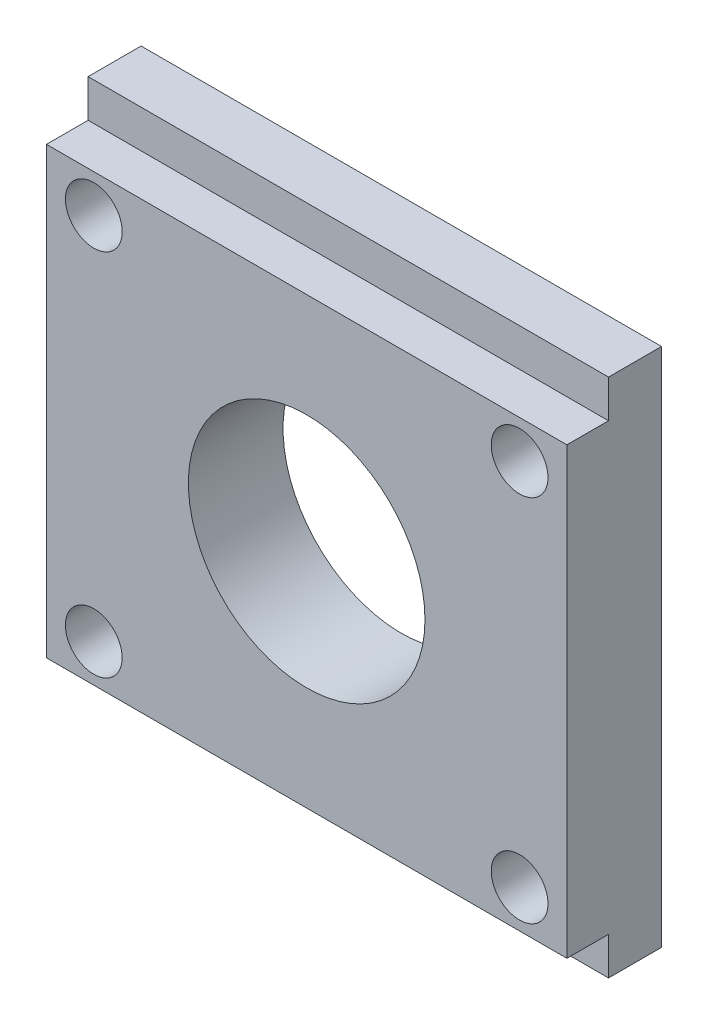
ISO-10303-21;
HEADER;
FILE_DESCRIPTION(('STEP AP214'),'2;1');
FILE_NAME('part.step','',(''),(''),'','','');
FILE_SCHEMA(('AUTOMOTIVE_DESIGN { 1 0 10303 214 1 1 1 1 }'));
ENDSEC;
DATA;
#1=APPLICATION_CONTEXT('core data for automotive mechanical design processes');
#2=APPLICATION_PROTOCOL_DEFINITION('international standard','automotive_design',2000,#1);
#3=PRODUCT_CONTEXT('',#1,'mechanical');
#4=PRODUCT('Part','Part','',(#3));
#5=PRODUCT_RELATED_PRODUCT_CATEGORY('part','',(#4));
#6=PRODUCT_DEFINITION_FORMATION('','',#4);
#7=PRODUCT_DEFINITION_CONTEXT('part definition',#1,'design');
#8=PRODUCT_DEFINITION('design','',#6,#7);
#9=PRODUCT_DEFINITION_SHAPE('','',#8);
#10=(LENGTH_UNIT() NAMED_UNIT(*) SI_UNIT(.MILLI.,.METRE.));
#11=(NAMED_UNIT(*) PLANE_ANGLE_UNIT() SI_UNIT($,.RADIAN.));
#12=(NAMED_UNIT(*) SI_UNIT($,.STERADIAN.) SOLID_ANGLE_UNIT());
#13=UNCERTAINTY_MEASURE_WITH_UNIT(LENGTH_MEASURE(1.E-05),#10,'distance_accuracy_value','');
#14=(GEOMETRIC_REPRESENTATION_CONTEXT(3) GLOBAL_UNCERTAINTY_ASSIGNED_CONTEXT((#13)) GLOBAL_UNIT_ASSIGNED_CONTEXT((#10,
#11,#12)) REPRESENTATION_CONTEXT('',''));
#15=CARTESIAN_POINT('',(0.,0.,0.));
#16=DIRECTION('',(0.,0.,1.));
#17=DIRECTION('',(1.,0.,0.));
#18=AXIS2_PLACEMENT_3D('',#15,#16,#17);
#19=CARTESIAN_POINT('',(0.,32.385,6.35));
#20=DIRECTION('',(0.,-1.,0.));
#21=DIRECTION('',(0.,0.,-1.));
#22=AXIS2_PLACEMENT_3D('',#19,#20,#21);
#23=PLANE('',#22);
#24=DIRECTION('',(0.,0.,1.));
#25=VECTOR('',#24,1.);
#26=CARTESIAN_POINT('',(0.,32.385,0.));
#27=LINE('',#26,#25);
#28=CARTESIAN_POINT('',(0.,32.385,6.35));
#29=VERTEX_POINT('',#28);
#30=CARTESIAN_POINT('',(0.,32.385,3.556));
#31=VERTEX_POINT('',#30);
#32=EDGE_CURVE('E99',#29,#31,#27,.F.);
#33=ORIENTED_EDGE('',*,*,#32,.F.);
#34=DIRECTION('',(1.,0.,0.));
#35=VECTOR('',#34,1.);
#36=CARTESIAN_POINT('',(17.4625,32.385,6.35));
#37=LINE('',#36,#35);
#38=CARTESIAN_POINT('',(34.925,32.385,6.35));
#39=VERTEX_POINT('',#38);
#40=EDGE_CURVE('E98',#39,#29,#37,.F.);
#41=ORIENTED_EDGE('',*,*,#40,.F.);
#42=DIRECTION('',(0.,0.,-1.));
#43=VECTOR('',#42,1.);
#44=CARTESIAN_POINT('',(34.925,32.385,0.));
#45=LINE('',#44,#43);
#46=CARTESIAN_POINT('',(34.925,32.385,3.556));
#47=VERTEX_POINT('',#46);
#48=EDGE_CURVE('E86',#47,#39,#45,.F.);
#49=ORIENTED_EDGE('',*,*,#48,.F.);
#50=DIRECTION('',(1.,0.,0.));
#51=VECTOR('',#50,1.);
#52=CARTESIAN_POINT('',(17.4625,32.385,3.556));
#53=LINE('',#52,#51);
#54=EDGE_CURVE('E80',#31,#47,#53,.T.);
#55=ORIENTED_EDGE('',*,*,#54,.F.);
#56=EDGE_LOOP('',(#33,#41,#49,#55));
#57=FACE_BOUND('',#56,.T.);
#58=ADVANCED_FACE('F17',(#57),#23,.F.);
#59=CARTESIAN_POINT('',(17.4625,33.655,3.556));
#60=DIRECTION('',(0.,0.,1.));
#61=DIRECTION('',(1.,0.,0.));
#62=AXIS2_PLACEMENT_3D('',#59,#60,#61);
#63=PLANE('',#62);
#64=DIRECTION('',(1.,0.,0.));
#65=VECTOR('',#64,1.);
#66=CARTESIAN_POINT('',(0.,34.925,3.556));
#67=LINE('',#66,#65);
#68=CARTESIAN_POINT('',(0.,34.925,3.556));
#69=VERTEX_POINT('',#68);
#70=CARTESIAN_POINT('',(34.925,34.925,3.556));
#71=VERTEX_POINT('',#70);
#72=EDGE_CURVE('E169',#69,#71,#67,.T.);
#73=ORIENTED_EDGE('',*,*,#72,.F.);
#74=DIRECTION('',(0.,1.,0.));
#75=VECTOR('',#74,1.);
#76=CARTESIAN_POINT('',(0.,0.,3.556));
#77=LINE('',#76,#75);
#78=EDGE_CURVE('E164',#31,#69,#77,.T.);
#79=ORIENTED_EDGE('',*,*,#78,.F.);
#80=ORIENTED_EDGE('',*,*,#54,.T.);
#81=DIRECTION('',(0.,1.,0.));
#82=VECTOR('',#81,1.);
#83=CARTESIAN_POINT('',(34.925,34.925,3.556));
#84=LINE('',#83,#82);
#85=EDGE_CURVE('E93',#71,#47,#84,.F.);
#86=ORIENTED_EDGE('',*,*,#85,.F.);
#87=EDGE_LOOP('',(#73,#79,#80,#86));
#88=FACE_BOUND('',#87,.T.);
#89=ADVANCED_FACE('F235',(#88),#63,.T.);
#90=CARTESIAN_POINT('',(34.925,2.54000000000003,6.35));
#91=DIRECTION('',(0.,1.,0.));
#92=DIRECTION('',(0.,0.,1.));
#93=AXIS2_PLACEMENT_3D('',#90,#91,#92);
#94=PLANE('',#93);
#95=DIRECTION('',(0.,0.,-1.));
#96=VECTOR('',#95,1.);
#97=CARTESIAN_POINT('',(34.925,2.54000000000003,0.));
#98=LINE('',#97,#96);
#99=CARTESIAN_POINT('',(34.925,2.54000000000001,6.35));
#100=VERTEX_POINT('',#99);
#101=CARTESIAN_POINT('',(34.925,2.54000000000003,3.556));
#102=VERTEX_POINT('',#101);
#103=EDGE_CURVE('E107',#100,#102,#98,.T.);
#104=ORIENTED_EDGE('',*,*,#103,.F.);
#105=DIRECTION('',(1.,0.,0.));
#106=VECTOR('',#105,1.);
#107=CARTESIAN_POINT('',(17.4625,2.54,6.35));
#108=LINE('',#107,#106);
#109=CARTESIAN_POINT('',(0.,2.54000000000001,6.35));
#110=VERTEX_POINT('',#109);
#111=EDGE_CURVE('E95',#110,#100,#108,.T.);
#112=ORIENTED_EDGE('',*,*,#111,.F.);
#113=DIRECTION('',(0.,0.,1.));
#114=VECTOR('',#113,1.);
#115=CARTESIAN_POINT('',(0.,2.54,0.));
#116=LINE('',#115,#114);
#117=CARTESIAN_POINT('',(0.,2.54000000000002,3.556));
#118=VERTEX_POINT('',#117);
#119=EDGE_CURVE('E157',#118,#110,#116,.T.);
#120=ORIENTED_EDGE('',*,*,#119,.F.);
#121=DIRECTION('',(1.,0.,0.));
#122=VECTOR('',#121,1.);
#123=CARTESIAN_POINT('',(17.4625,2.54000000000003,3.556));
#124=LINE('',#123,#122);
#125=EDGE_CURVE('E103',#102,#118,#124,.F.);
#126=ORIENTED_EDGE('',*,*,#125,.F.);
#127=EDGE_LOOP('',(#104,#112,#120,#126));
#128=FACE_BOUND('',#127,.T.);
#129=ADVANCED_FACE('F237',(#128),#94,.F.);
#130=CARTESIAN_POINT('',(17.4625,1.27,3.556));
#131=DIRECTION('',(0.,0.,1.));
#132=DIRECTION('',(1.,0.,0.));
#133=AXIS2_PLACEMENT_3D('',#130,#131,#132);
#134=PLANE('',#133);
#135=DIRECTION('',(0.,1.,0.));
#136=VECTOR('',#135,1.);
#137=CARTESIAN_POINT('',(0.,0.,3.556));
#138=LINE('',#137,#136);
#139=CARTESIAN_POINT('',(0.,0.,3.556));
#140=VERTEX_POINT('',#139);
#141=EDGE_CURVE('E159',#140,#118,#138,.T.);
#142=ORIENTED_EDGE('',*,*,#141,.F.);
#143=DIRECTION('',(1.,0.,0.));
#144=VECTOR('',#143,1.);
#145=CARTESIAN_POINT('',(34.925,0.,3.556));
#146=LINE('',#145,#144);
#147=CARTESIAN_POINT('',(34.925,0.,3.556));
#148=VERTEX_POINT('',#147);
#149=EDGE_CURVE('E149',#148,#140,#146,.F.);
#150=ORIENTED_EDGE('',*,*,#149,.F.);
#151=DIRECTION('',(0.,1.,0.));
#152=VECTOR('',#151,1.);
#153=CARTESIAN_POINT('',(34.925,34.925,3.556));
#154=LINE('',#153,#152);
#155=EDGE_CURVE('E109',#102,#148,#154,.F.);
#156=ORIENTED_EDGE('',*,*,#155,.F.);
#157=ORIENTED_EDGE('',*,*,#125,.T.);
#158=EDGE_LOOP('',(#142,#150,#156,#157));
#159=FACE_BOUND('',#158,.T.);
#160=ADVANCED_FACE('F176',(#159),#134,.T.);
#161=CARTESIAN_POINT('',(17.4625,17.4625,6.35));
#162=DIRECTION('',(0.,0.,1.));
#163=DIRECTION('',(1.,0.,0.));
#164=AXIS2_PLACEMENT_3D('',#161,#162,#163);
#165=PLANE('',#164);
#166=CARTESIAN_POINT('',(17.4625,17.4625,6.35));
#167=DIRECTION('',(0.,0.,1.));
#168=DIRECTION('',(1.,0.,0.));
#169=AXIS2_PLACEMENT_3D('',#166,#167,#168);
#170=CIRCLE('',#169,7.9375);
#171=CARTESIAN_POINT('',(25.4,17.4625,6.35));
#172=VERTEX_POINT('',#171);
#173=EDGE_CURVE('E20',#172,#172,#170,.F.);
#174=ORIENTED_EDGE('',*,*,#173,.T.);
#175=EDGE_LOOP('',(#174));
#176=FACE_BOUND('',#175,.T.);
#177=CARTESIAN_POINT('',(31.75,5.08,6.35));
#178=DIRECTION('',(0.,0.,1.));
#179=DIRECTION('',(1.,0.,0.));
#180=AXIS2_PLACEMENT_3D('',#177,#178,#179);
#181=CIRCLE('',#180,1.905);
#182=CARTESIAN_POINT('',(33.655,5.08,6.35));
#183=VERTEX_POINT('',#182);
#184=EDGE_CURVE('E137',#183,#183,#181,.F.);
#185=ORIENTED_EDGE('',*,*,#184,.T.);
#186=EDGE_LOOP('',(#185));
#187=FACE_BOUND('',#186,.T.);
#188=CARTESIAN_POINT('',(3.175,5.08,6.35));
#189=DIRECTION('',(0.,0.,1.));
#190=DIRECTION('',(1.,0.,0.));
#191=AXIS2_PLACEMENT_3D('',#188,#189,#190);
#192=CIRCLE('',#191,1.905);
#193=CARTESIAN_POINT('',(5.08,5.08,6.35));
#194=VERTEX_POINT('',#193);
#195=EDGE_CURVE('E135',#194,#194,#192,.F.);
#196=ORIENTED_EDGE('',*,*,#195,.T.);
#197=EDGE_LOOP('',(#196));
#198=FACE_BOUND('',#197,.T.);
#199=CARTESIAN_POINT('',(31.75,29.845,6.35));
#200=DIRECTION('',(0.,0.,1.));
#201=DIRECTION('',(1.,0.,0.));
#202=AXIS2_PLACEMENT_3D('',#199,#200,#201);
#203=CIRCLE('',#202,1.905);
#204=CARTESIAN_POINT('',(33.655,29.845,6.35));
#205=VERTEX_POINT('',#204);
#206=EDGE_CURVE('E132',#205,#205,#203,.F.);
#207=ORIENTED_EDGE('',*,*,#206,.T.);
#208=EDGE_LOOP('',(#207));
#209=FACE_BOUND('',#208,.T.);
#210=CARTESIAN_POINT('',(3.175,29.845,6.35));
#211=DIRECTION('',(0.,0.,1.));
#212=DIRECTION('',(1.,0.,0.));
#213=AXIS2_PLACEMENT_3D('',#210,#211,#212);
#214=CIRCLE('',#213,1.905);
#215=CARTESIAN_POINT('',(5.08,29.845,6.35));
#216=VERTEX_POINT('',#215);
#217=EDGE_CURVE('E128',#216,#216,#214,.F.);
#218=ORIENTED_EDGE('',*,*,#217,.T.);
#219=EDGE_LOOP('',(#218));
#220=FACE_BOUND('',#219,.T.);
#221=ORIENTED_EDGE('',*,*,#111,.T.);
#222=DIRECTION('',(0.,1.,0.));
#223=VECTOR('',#222,1.);
#224=CARTESIAN_POINT('',(34.925,34.925,6.35));
#225=LINE('',#224,#223);
#226=EDGE_CURVE('E91',#39,#100,#225,.F.);
#227=ORIENTED_EDGE('',*,*,#226,.F.);
#228=ORIENTED_EDGE('',*,*,#40,.T.);
#229=DIRECTION('',(0.,1.,0.));
#230=VECTOR('',#229,1.);
#231=CARTESIAN_POINT('',(0.,0.,6.35));
#232=LINE('',#231,#230);
#233=EDGE_CURVE('E155',#110,#29,#232,.T.);
#234=ORIENTED_EDGE('',*,*,#233,.F.);
#235=EDGE_LOOP('',(#221,#227,#228,#234));
#236=FACE_BOUND('',#235,.T.);
#237=ADVANCED_FACE('F105',(#176,#187,#198,#209,#220,#236),#165,.T.);
#238=CARTESIAN_POINT('',(34.925,34.925,0.));
#239=DIRECTION('',(1.,0.,0.));
#240=DIRECTION('',(0.,0.,-1.));
#241=AXIS2_PLACEMENT_3D('',#238,#239,#240);
#242=PLANE('',#241);
#243=DIRECTION('',(0.,0.,1.));
#244=VECTOR('',#243,1.);
#245=CARTESIAN_POINT('',(34.925,34.925,0.));
#246=LINE('',#245,#244);
#247=CARTESIAN_POINT('',(34.925,34.925,0.));
#248=VERTEX_POINT('',#247);
#249=EDGE_CURVE('E167',#71,#248,#246,.F.);
#250=ORIENTED_EDGE('',*,*,#249,.F.);
#251=ORIENTED_EDGE('',*,*,#85,.T.);
#252=ORIENTED_EDGE('',*,*,#48,.T.);
#253=ORIENTED_EDGE('',*,*,#226,.T.);
#254=ORIENTED_EDGE('',*,*,#103,.T.);
#255=ORIENTED_EDGE('',*,*,#155,.T.);
#256=DIRECTION('',(0.,0.,-1.));
#257=VECTOR('',#256,1.);
#258=CARTESIAN_POINT('',(34.925,0.,0.));
#259=LINE('',#258,#257);
#260=CARTESIAN_POINT('',(34.925,0.,0.));
#261=VERTEX_POINT('',#260);
#262=EDGE_CURVE('E142',#261,#148,#259,.F.);
#263=ORIENTED_EDGE('',*,*,#262,.F.);
#264=DIRECTION('',(0.,1.,0.));
#265=VECTOR('',#264,1.);
#266=CARTESIAN_POINT('',(34.925,17.4625,0.));
#267=LINE('',#266,#265);
#268=EDGE_CURVE('E131',#261,#248,#267,.T.);
#269=ORIENTED_EDGE('',*,*,#268,.T.);
#270=EDGE_LOOP('',(#250,#251,#252,#253,#254,#255,#263,#269));
#271=FACE_BOUND('',#270,.T.);
#272=ADVANCED_FACE('F89',(#271),#242,.T.);
#273=CARTESIAN_POINT('',(0.,34.925,0.));
#274=DIRECTION('',(0.,1.,0.));
#275=DIRECTION('',(0.,0.,1.));
#276=AXIS2_PLACEMENT_3D('',#273,#274,#275);
#277=PLANE('',#276);
#278=DIRECTION('',(1.,0.,0.));
#279=VECTOR('',#278,1.);
#280=CARTESIAN_POINT('',(17.4625,34.925,0.));
#281=LINE('',#280,#279);
#282=CARTESIAN_POINT('',(0.,34.925,0.));
#283=VERTEX_POINT('',#282);
#284=EDGE_CURVE('E229',#248,#283,#281,.F.);
#285=ORIENTED_EDGE('',*,*,#284,.T.);
#286=DIRECTION('',(0.,0.,1.));
#287=VECTOR('',#286,1.);
#288=CARTESIAN_POINT('',(0.,34.925,0.));
#289=LINE('',#288,#287);
#290=EDGE_CURVE('E162',#69,#283,#289,.F.);
#291=ORIENTED_EDGE('',*,*,#290,.F.);
#292=ORIENTED_EDGE('',*,*,#72,.T.);
#293=ORIENTED_EDGE('',*,*,#249,.T.);
#294=EDGE_LOOP('',(#285,#291,#292,#293));
#295=FACE_BOUND('',#294,.T.);
#296=ADVANCED_FACE('F190',(#295),#277,.T.);
#297=CARTESIAN_POINT('',(0.,0.,0.));
#298=DIRECTION('',(-1.,0.,0.));
#299=DIRECTION('',(0.,0.,1.));
#300=AXIS2_PLACEMENT_3D('',#297,#298,#299);
#301=PLANE('',#300);
#302=ORIENTED_EDGE('',*,*,#119,.T.);
#303=ORIENTED_EDGE('',*,*,#233,.T.);
#304=ORIENTED_EDGE('',*,*,#32,.T.);
#305=ORIENTED_EDGE('',*,*,#78,.T.);
#306=ORIENTED_EDGE('',*,*,#290,.T.);
#307=DIRECTION('',(0.,1.,0.));
#308=VECTOR('',#307,1.);
#309=CARTESIAN_POINT('',(0.,17.4625,0.));
#310=LINE('',#309,#308);
#311=CARTESIAN_POINT('',(0.,0.,0.));
#312=VERTEX_POINT('',#311);
#313=EDGE_CURVE('E227',#283,#312,#310,.F.);
#314=ORIENTED_EDGE('',*,*,#313,.T.);
#315=DIRECTION('',(0.,0.,-1.));
#316=VECTOR('',#315,1.);
#317=CARTESIAN_POINT('',(0.,0.,0.));
#318=LINE('',#317,#316);
#319=EDGE_CURVE('E35',#140,#312,#318,.T.);
#320=ORIENTED_EDGE('',*,*,#319,.F.);
#321=ORIENTED_EDGE('',*,*,#141,.T.);
#322=EDGE_LOOP('',(#302,#303,#304,#305,#306,#314,#320,#321));
#323=FACE_BOUND('',#322,.T.);
#324=ADVANCED_FACE('F180',(#323),#301,.T.);
#325=CARTESIAN_POINT('',(34.925,0.,0.));
#326=DIRECTION('',(0.,-1.,0.));
#327=DIRECTION('',(0.,0.,-1.));
#328=AXIS2_PLACEMENT_3D('',#325,#326,#327);
#329=PLANE('',#328);
#330=DIRECTION('',(1.,0.,0.));
#331=VECTOR('',#330,1.);
#332=CARTESIAN_POINT('',(17.4625,0.,0.));
#333=LINE('',#332,#331);
#334=EDGE_CURVE('E127',#312,#261,#333,.T.);
#335=ORIENTED_EDGE('',*,*,#334,.T.);
#336=ORIENTED_EDGE('',*,*,#262,.T.);
#337=ORIENTED_EDGE('',*,*,#149,.T.);
#338=ORIENTED_EDGE('',*,*,#319,.T.);
#339=EDGE_LOOP('',(#335,#336,#337,#338));
#340=FACE_BOUND('',#339,.T.);
#341=ADVANCED_FACE('F177',(#340),#329,.T.);
#342=CARTESIAN_POINT('',(17.4625,17.4625,0.));
#343=DIRECTION('',(0.,0.,1.));
#344=DIRECTION('',(1.,0.,0.));
#345=AXIS2_PLACEMENT_3D('',#342,#343,#344);
#346=CYLINDRICAL_SURFACE('',#345,7.9375);
#347=CARTESIAN_POINT('',(17.4625,17.4625,0.));
#348=DIRECTION('',(0.,0.,1.));
#349=DIRECTION('',(1.,0.,0.));
#350=AXIS2_PLACEMENT_3D('',#347,#348,#349);
#351=CIRCLE('',#350,7.9375);
#352=CARTESIAN_POINT('',(25.4,17.4625,0.));
#353=VERTEX_POINT('',#352);
#354=EDGE_CURVE('E124',#353,#353,#351,.F.);
#355=ORIENTED_EDGE('',*,*,#354,.T.);
#356=EDGE_LOOP('',(#355));
#357=FACE_BOUND('',#356,.T.);
#358=ORIENTED_EDGE('',*,*,#173,.F.);
#359=EDGE_LOOP('',(#358));
#360=FACE_BOUND('',#359,.T.);
#361=ADVANCED_FACE('F179',(#357,#360),#346,.F.);
#362=CARTESIAN_POINT('',(31.75,5.08,0.));
#363=DIRECTION('',(0.,0.,1.));
#364=DIRECTION('',(1.,0.,0.));
#365=AXIS2_PLACEMENT_3D('',#362,#363,#364);
#366=CYLINDRICAL_SURFACE('',#365,1.905);
#367=CARTESIAN_POINT('',(31.75,5.08,0.));
#368=DIRECTION('',(0.,0.,1.));
#369=DIRECTION('',(1.,0.,0.));
#370=AXIS2_PLACEMENT_3D('',#367,#368,#369);
#371=CIRCLE('',#370,1.905);
#372=CARTESIAN_POINT('',(33.655,5.08,0.));
#373=VERTEX_POINT('',#372);
#374=EDGE_CURVE('E121',#373,#373,#371,.F.);
#375=ORIENTED_EDGE('',*,*,#374,.T.);
#376=EDGE_LOOP('',(#375));
#377=FACE_BOUND('',#376,.T.);
#378=ORIENTED_EDGE('',*,*,#184,.F.);
#379=EDGE_LOOP('',(#378));
#380=FACE_BOUND('',#379,.T.);
#381=ADVANCED_FACE('F187',(#377,#380),#366,.F.);
#382=CARTESIAN_POINT('',(3.175,5.08,0.));
#383=DIRECTION('',(0.,0.,1.));
#384=DIRECTION('',(1.,0.,0.));
#385=AXIS2_PLACEMENT_3D('',#382,#383,#384);
#386=CYLINDRICAL_SURFACE('',#385,1.905);
#387=CARTESIAN_POINT('',(3.175,5.08,0.));
#388=DIRECTION('',(0.,0.,1.));
#389=DIRECTION('',(1.,0.,0.));
#390=AXIS2_PLACEMENT_3D('',#387,#388,#389);
#391=CIRCLE('',#390,1.905);
#392=CARTESIAN_POINT('',(5.08,5.08,0.));
#393=VERTEX_POINT('',#392);
#394=EDGE_CURVE('E118',#393,#393,#391,.F.);
#395=ORIENTED_EDGE('',*,*,#394,.T.);
#396=EDGE_LOOP('',(#395));
#397=FACE_BOUND('',#396,.T.);
#398=ORIENTED_EDGE('',*,*,#195,.F.);
#399=EDGE_LOOP('',(#398));
#400=FACE_BOUND('',#399,.T.);
#401=ADVANCED_FACE('F209',(#397,#400),#386,.F.);
#402=CARTESIAN_POINT('',(31.75,29.845,0.));
#403=DIRECTION('',(0.,0.,1.));
#404=DIRECTION('',(1.,0.,0.));
#405=AXIS2_PLACEMENT_3D('',#402,#403,#404);
#406=CYLINDRICAL_SURFACE('',#405,1.905);
#407=CARTESIAN_POINT('',(31.75,29.845,0.));
#408=DIRECTION('',(0.,0.,1.));
#409=DIRECTION('',(1.,0.,0.));
#410=AXIS2_PLACEMENT_3D('',#407,#408,#409);
#411=CIRCLE('',#410,1.905);
#412=CARTESIAN_POINT('',(33.655,29.845,0.));
#413=VERTEX_POINT('',#412);
#414=EDGE_CURVE('E26',#413,#413,#411,.F.);
#415=ORIENTED_EDGE('',*,*,#414,.T.);
#416=EDGE_LOOP('',(#415));
#417=FACE_BOUND('',#416,.T.);
#418=ORIENTED_EDGE('',*,*,#206,.F.);
#419=EDGE_LOOP('',(#418));
#420=FACE_BOUND('',#419,.T.);
#421=ADVANCED_FACE('F201',(#417,#420),#406,.F.);
#422=CARTESIAN_POINT('',(3.175,29.845,0.));
#423=DIRECTION('',(0.,0.,1.));
#424=DIRECTION('',(1.,0.,0.));
#425=AXIS2_PLACEMENT_3D('',#422,#423,#424);
#426=CYLINDRICAL_SURFACE('',#425,1.905);
#427=CARTESIAN_POINT('',(3.175,29.845,0.));
#428=DIRECTION('',(0.,0.,1.));
#429=DIRECTION('',(1.,0.,0.));
#430=AXIS2_PLACEMENT_3D('',#427,#428,#429);
#431=CIRCLE('',#430,1.905);
#432=CARTESIAN_POINT('',(5.08,29.845,0.));
#433=VERTEX_POINT('',#432);
#434=EDGE_CURVE('E11',#433,#433,#431,.F.);
#435=ORIENTED_EDGE('',*,*,#434,.T.);
#436=EDGE_LOOP('',(#435));
#437=FACE_BOUND('',#436,.T.);
#438=ORIENTED_EDGE('',*,*,#217,.F.);
#439=EDGE_LOOP('',(#438));
#440=FACE_BOUND('',#439,.T.);
#441=ADVANCED_FACE('F195',(#437,#440),#426,.F.);
#442=CARTESIAN_POINT('',(17.4625,17.4625,0.));
#443=DIRECTION('',(0.,0.,1.));
#444=DIRECTION('',(1.,0.,0.));
#445=AXIS2_PLACEMENT_3D('',#442,#443,#444);
#446=PLANE('',#445);
#447=ORIENTED_EDGE('',*,*,#434,.F.);
#448=EDGE_LOOP('',(#447));
#449=FACE_BOUND('',#448,.T.);
#450=ORIENTED_EDGE('',*,*,#414,.F.);
#451=EDGE_LOOP('',(#450));
#452=FACE_BOUND('',#451,.T.);
#453=ORIENTED_EDGE('',*,*,#394,.F.);
#454=EDGE_LOOP('',(#453));
#455=FACE_BOUND('',#454,.T.);
#456=ORIENTED_EDGE('',*,*,#374,.F.);
#457=EDGE_LOOP('',(#456));
#458=FACE_BOUND('',#457,.T.);
#459=ORIENTED_EDGE('',*,*,#354,.F.);
#460=EDGE_LOOP('',(#459));
#461=FACE_BOUND('',#460,.T.);
#462=ORIENTED_EDGE('',*,*,#313,.F.);
#463=ORIENTED_EDGE('',*,*,#284,.F.);
#464=ORIENTED_EDGE('',*,*,#268,.F.);
#465=ORIENTED_EDGE('',*,*,#334,.F.);
#466=EDGE_LOOP('',(#462,#463,#464,#465));
#467=FACE_BOUND('',#466,.T.);
#468=ADVANCED_FACE('F193',(#449,#452,#455,#458,#461,#467),#446,.F.);
#469=CLOSED_SHELL('',(#58,#89,#129,#160,#237,#272,#296,#324,#341,#361,#381,#401,#421,#441,#468));
#470=MANIFOLD_SOLID_BREP('B1',#469);
#471=ADVANCED_BREP_SHAPE_REPRESENTATION('',(#18,#470),#14);
#472=SHAPE_DEFINITION_REPRESENTATION(#9,#471);
ENDSEC;
END-ISO-10303-21;
